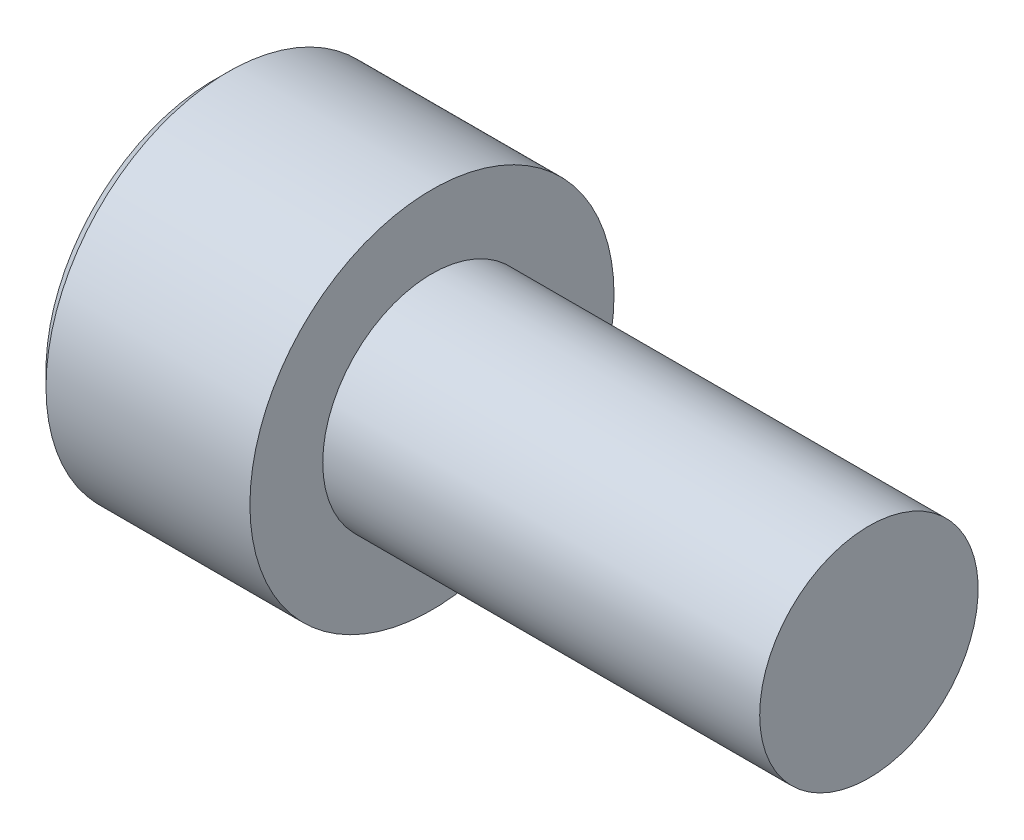
ISO-10303-21;
HEADER;
FILE_DESCRIPTION(('STEP AP214'),'2;1');
FILE_NAME('part.step','',(''),(''),'','','');
FILE_SCHEMA(('AUTOMOTIVE_DESIGN { 1 0 10303 214 1 1 1 1 }'));
ENDSEC;
DATA;
#1=APPLICATION_CONTEXT('core data for automotive mechanical design processes');
#2=APPLICATION_PROTOCOL_DEFINITION('international standard','automotive_design',2000,#1);
#3=PRODUCT_CONTEXT('',#1,'mechanical');
#4=PRODUCT('Part','Part','',(#3));
#5=PRODUCT_RELATED_PRODUCT_CATEGORY('part','',(#4));
#6=PRODUCT_DEFINITION_FORMATION('','',#4);
#7=PRODUCT_DEFINITION_CONTEXT('part definition',#1,'design');
#8=PRODUCT_DEFINITION('design','',#6,#7);
#9=PRODUCT_DEFINITION_SHAPE('','',#8);
#10=(LENGTH_UNIT() NAMED_UNIT(*) SI_UNIT(.MILLI.,.METRE.));
#11=(NAMED_UNIT(*) PLANE_ANGLE_UNIT() SI_UNIT($,.RADIAN.));
#12=(NAMED_UNIT(*) SI_UNIT($,.STERADIAN.) SOLID_ANGLE_UNIT());
#13=UNCERTAINTY_MEASURE_WITH_UNIT(LENGTH_MEASURE(1.E-05),#10,'distance_accuracy_value','');
#14=(GEOMETRIC_REPRESENTATION_CONTEXT(3) GLOBAL_UNCERTAINTY_ASSIGNED_CONTEXT((#13)) GLOBAL_UNIT_ASSIGNED_CONTEXT((#10,
#11,#12)) REPRESENTATION_CONTEXT('',''));
#15=CARTESIAN_POINT('',(0.,0.,0.));
#16=DIRECTION('',(0.,0.,1.));
#17=DIRECTION('',(1.,0.,0.));
#18=AXIS2_PLACEMENT_3D('',#15,#16,#17);
#19=CARTESIAN_POINT('',(-6.,5.,0.));
#20=DIRECTION('',(1.,0.,0.));
#21=DIRECTION('',(0.,0.,-1.));
#22=AXIS2_PLACEMENT_3D('',#19,#20,#21);
#23=PLANE('',#22);
#24=CARTESIAN_POINT('',(-6.,0.,0.));
#25=DIRECTION('',(1.,0.,0.));
#26=DIRECTION('',(0.,0.,-1.));
#27=AXIS2_PLACEMENT_3D('',#24,#25,#26);
#28=CIRCLE('',#27,4.6);
#29=CARTESIAN_POINT('',(-6.,0.,-4.6));
#30=VERTEX_POINT('',#29);
#31=EDGE_CURVE('E44',#30,#30,#28,.F.);
#32=ORIENTED_EDGE('',*,*,#31,.T.);
#33=EDGE_LOOP('',(#32));
#34=FACE_BOUND('',#33,.T.);
#35=DIRECTION('',(0.,0.866025403784438,-0.5));
#36=VECTOR('',#35,1.);
#37=CARTESIAN_POINT('',(-6.,0.,2.88675134594813));
#38=LINE('',#37,#36);
#39=CARTESIAN_POINT('',(-6.,0.,2.88675134594813));
#40=VERTEX_POINT('',#39);
#41=CARTESIAN_POINT('',(-6.,2.5,1.44337567297406));
#42=VERTEX_POINT('',#41);
#43=EDGE_CURVE('E148',#40,#42,#38,.T.);
#44=ORIENTED_EDGE('',*,*,#43,.F.);
#45=DIRECTION('',(0.,0.866025403784439,0.5));
#46=VECTOR('',#45,1.);
#47=CARTESIAN_POINT('',(-6.,-2.5,1.44337567297407));
#48=LINE('',#47,#46);
#49=CARTESIAN_POINT('',(-6.,-2.5,1.44337567297407));
#50=VERTEX_POINT('',#49);
#51=EDGE_CURVE('E51',#50,#40,#48,.T.);
#52=ORIENTED_EDGE('',*,*,#51,.F.);
#53=DIRECTION('',(0.,0.,1.));
#54=VECTOR('',#53,1.);
#55=CARTESIAN_POINT('',(-6.,-2.5,-1.44337567297406));
#56=LINE('',#55,#54);
#57=CARTESIAN_POINT('',(-6.,-2.5,-1.44337567297406));
#58=VERTEX_POINT('',#57);
#59=EDGE_CURVE('E117',#58,#50,#56,.T.);
#60=ORIENTED_EDGE('',*,*,#59,.F.);
#61=DIRECTION('',(0.,-0.866025403784439,0.5));
#62=VECTOR('',#61,1.);
#63=CARTESIAN_POINT('',(-6.,0.,-2.88675134594813));
#64=LINE('',#63,#62);
#65=CARTESIAN_POINT('',(-6.,0.,-2.88675134594813));
#66=VERTEX_POINT('',#65);
#67=EDGE_CURVE('E154',#66,#58,#64,.T.);
#68=ORIENTED_EDGE('',*,*,#67,.F.);
#69=DIRECTION('',(0.,-0.866025403784439,-0.5));
#70=VECTOR('',#69,1.);
#71=CARTESIAN_POINT('',(-6.,2.5,-1.44337567297406));
#72=LINE('',#71,#70);
#73=CARTESIAN_POINT('',(-6.,2.5,-1.44337567297406));
#74=VERTEX_POINT('',#73);
#75=EDGE_CURVE('E152',#74,#66,#72,.T.);
#76=ORIENTED_EDGE('',*,*,#75,.F.);
#77=DIRECTION('',(0.,0.,-1.));
#78=VECTOR('',#77,1.);
#79=CARTESIAN_POINT('',(-6.,2.5,1.44337567297406));
#80=LINE('',#79,#78);
#81=EDGE_CURVE('E150',#42,#74,#80,.T.);
#82=ORIENTED_EDGE('',*,*,#81,.F.);
#83=EDGE_LOOP('',(#44,#52,#60,#68,#76,#82));
#84=FACE_BOUND('',#83,.T.);
#85=ADVANCED_FACE('F36',(#34,#84),#23,.F.);
#86=CARTESIAN_POINT('',(12.,0.,0.));
#87=DIRECTION('',(-1.,0.,0.));
#88=DIRECTION('',(0.,0.,1.));
#89=AXIS2_PLACEMENT_3D('',#86,#87,#88);
#90=PLANE('',#89);
#91=CARTESIAN_POINT('',(12.,0.,0.));
#92=DIRECTION('',(-1.,0.,0.));
#93=DIRECTION('',(0.,0.,1.));
#94=AXIS2_PLACEMENT_3D('',#91,#92,#93);
#95=CIRCLE('',#94,3.);
#96=CARTESIAN_POINT('',(12.,0.,3.));
#97=VERTEX_POINT('',#96);
#98=EDGE_CURVE('E180',#97,#97,#95,.T.);
#99=ORIENTED_EDGE('',*,*,#98,.F.);
#100=EDGE_LOOP('',(#99));
#101=FACE_BOUND('',#100,.T.);
#102=ADVANCED_FACE('F197',(#101),#90,.F.);
#103=CARTESIAN_POINT('',(-6.,0.,0.));
#104=DIRECTION('',(-1.,0.,0.));
#105=DIRECTION('',(0.,0.,1.));
#106=AXIS2_PLACEMENT_3D('',#103,#104,#105);
#107=CYLINDRICAL_SURFACE('',#106,3.);
#108=CARTESIAN_POINT('',(0.,0.,0.));
#109=DIRECTION('',(-1.,0.,0.));
#110=DIRECTION('',(0.,0.,1.));
#111=AXIS2_PLACEMENT_3D('',#108,#109,#110);
#112=CIRCLE('',#111,3.);
#113=CARTESIAN_POINT('',(0.,0.,3.));
#114=VERTEX_POINT('',#113);
#115=EDGE_CURVE('E177',#114,#114,#112,.T.);
#116=ORIENTED_EDGE('',*,*,#115,.F.);
#117=EDGE_LOOP('',(#116));
#118=FACE_BOUND('',#117,.T.);
#119=ORIENTED_EDGE('',*,*,#98,.T.);
#120=EDGE_LOOP('',(#119));
#121=FACE_BOUND('',#120,.T.);
#122=ADVANCED_FACE('F201',(#118,#121),#107,.T.);
#123=CARTESIAN_POINT('',(0.,3.,0.));
#124=DIRECTION('',(-1.,0.,0.));
#125=DIRECTION('',(0.,0.,1.));
#126=AXIS2_PLACEMENT_3D('',#123,#124,#125);
#127=PLANE('',#126);
#128=CARTESIAN_POINT('',(0.,0.,0.));
#129=DIRECTION('',(-1.,0.,0.));
#130=DIRECTION('',(0.,0.,1.));
#131=AXIS2_PLACEMENT_3D('',#128,#129,#130);
#132=CIRCLE('',#131,5.);
#133=CARTESIAN_POINT('',(0.,0.,5.));
#134=VERTEX_POINT('',#133);
#135=EDGE_CURVE('E173',#134,#134,#132,.T.);
#136=ORIENTED_EDGE('',*,*,#135,.F.);
#137=EDGE_LOOP('',(#136));
#138=FACE_BOUND('',#137,.T.);
#139=ORIENTED_EDGE('',*,*,#115,.T.);
#140=EDGE_LOOP('',(#139));
#141=FACE_BOUND('',#140,.T.);
#142=ADVANCED_FACE('F207',(#138,#141),#127,.F.);
#143=CARTESIAN_POINT('',(-6.,0.,0.));
#144=DIRECTION('',(-1.,0.,0.));
#145=DIRECTION('',(0.,0.,1.));
#146=AXIS2_PLACEMENT_3D('',#143,#144,#145);
#147=CYLINDRICAL_SURFACE('',#146,5.);
#148=CARTESIAN_POINT('',(-5.6,0.,0.));
#149=DIRECTION('',(1.,0.,0.));
#150=DIRECTION('',(0.,0.,-1.));
#151=AXIS2_PLACEMENT_3D('',#148,#149,#150);
#152=CIRCLE('',#151,5.);
#153=CARTESIAN_POINT('',(-5.6,0.,-5.));
#154=VERTEX_POINT('',#153);
#155=EDGE_CURVE('E11',#154,#154,#152,.T.);
#156=ORIENTED_EDGE('',*,*,#155,.T.);
#157=EDGE_LOOP('',(#156));
#158=FACE_BOUND('',#157,.T.);
#159=ORIENTED_EDGE('',*,*,#135,.T.);
#160=EDGE_LOOP('',(#159));
#161=FACE_BOUND('',#160,.T.);
#162=ADVANCED_FACE('F211',(#158,#161),#147,.T.);
#163=CARTESIAN_POINT('',(-3.,-2.5,1.44337567297407));
#164=DIRECTION('',(0.,-0.5,0.866025403784439));
#165=DIRECTION('',(0.,-0.866025403784439,-0.5));
#166=AXIS2_PLACEMENT_3D('',#163,#164,#165);
#167=PLANE('',#166);
#168=DIRECTION('',(0.,0.866025403784439,0.5));
#169=VECTOR('',#168,1.);
#170=CARTESIAN_POINT('',(-3.,-2.5,1.44337567297407));
#171=LINE('',#170,#169);
#172=CARTESIAN_POINT('',(-3.,-2.5,1.44337567297407));
#173=VERTEX_POINT('',#172);
#174=CARTESIAN_POINT('',(-3.,-1.25,2.1650635094611));
#175=VERTEX_POINT('',#174);
#176=EDGE_CURVE('E116',#173,#175,#171,.T.);
#177=ORIENTED_EDGE('',*,*,#176,.F.);
#178=DIRECTION('',(-1.,0.,0.));
#179=VECTOR('',#178,1.);
#180=CARTESIAN_POINT('',(-3.,-2.5,1.44337567297407));
#181=LINE('',#180,#179);
#182=EDGE_CURVE('E157',#173,#50,#181,.T.);
#183=ORIENTED_EDGE('',*,*,#182,.T.);
#184=ORIENTED_EDGE('',*,*,#51,.T.);
#185=DIRECTION('',(-1.,0.,0.));
#186=VECTOR('',#185,1.);
#187=CARTESIAN_POINT('',(-3.,0.,2.88675134594813));
#188=LINE('',#187,#186);
#189=CARTESIAN_POINT('',(-3.,0.,2.88675134594813));
#190=VERTEX_POINT('',#189);
#191=EDGE_CURVE('E120',#190,#40,#188,.T.);
#192=ORIENTED_EDGE('',*,*,#191,.F.);
#193=EDGE_CURVE('E110',#175,#190,#171,.T.);
#194=ORIENTED_EDGE('',*,*,#193,.F.);
#195=EDGE_LOOP('',(#177,#183,#184,#192,#194));
#196=FACE_BOUND('',#195,.T.);
#197=ADVANCED_FACE('F121',(#196),#167,.F.);
#198=CARTESIAN_POINT('',(-3.,-2.5,-1.44337567297406));
#199=DIRECTION('',(0.,-1.,0.));
#200=DIRECTION('',(0.,0.,-1.));
#201=AXIS2_PLACEMENT_3D('',#198,#199,#200);
#202=PLANE('',#201);
#203=DIRECTION('',(0.,0.,1.));
#204=VECTOR('',#203,1.);
#205=CARTESIAN_POINT('',(-3.,-2.5,-1.44337567297406));
#206=LINE('',#205,#204);
#207=CARTESIAN_POINT('',(-3.,-2.5,-1.44337567297406));
#208=VERTEX_POINT('',#207);
#209=CARTESIAN_POINT('',(-3.,-2.5,0.));
#210=VERTEX_POINT('',#209);
#211=EDGE_CURVE('E124',#208,#210,#206,.T.);
#212=ORIENTED_EDGE('',*,*,#211,.F.);
#213=DIRECTION('',(-1.,0.,0.));
#214=VECTOR('',#213,1.);
#215=CARTESIAN_POINT('',(-3.,-2.5,-1.44337567297406));
#216=LINE('',#215,#214);
#217=EDGE_CURVE('E159',#208,#58,#216,.T.);
#218=ORIENTED_EDGE('',*,*,#217,.T.);
#219=ORIENTED_EDGE('',*,*,#59,.T.);
#220=ORIENTED_EDGE('',*,*,#182,.F.);
#221=EDGE_CURVE('E144',#210,#173,#206,.T.);
#222=ORIENTED_EDGE('',*,*,#221,.F.);
#223=EDGE_LOOP('',(#212,#218,#219,#220,#222));
#224=FACE_BOUND('',#223,.T.);
#225=ADVANCED_FACE('F218',(#224),#202,.F.);
#226=CARTESIAN_POINT('',(-3.,0.,-2.88675134594813));
#227=DIRECTION('',(0.,-0.5,-0.866025403784438));
#228=DIRECTION('',(0.,0.866025403784439,-0.5));
#229=AXIS2_PLACEMENT_3D('',#226,#227,#228);
#230=PLANE('',#229);
#231=DIRECTION('',(0.,-0.866025403784439,0.5));
#232=VECTOR('',#231,1.);
#233=CARTESIAN_POINT('',(-3.,0.,-2.88675134594813));
#234=LINE('',#233,#232);
#235=CARTESIAN_POINT('',(-3.,0.,-2.88675134594813));
#236=VERTEX_POINT('',#235);
#237=CARTESIAN_POINT('',(-3.,-1.25,-2.1650635094611));
#238=VERTEX_POINT('',#237);
#239=EDGE_CURVE('E141',#236,#238,#234,.T.);
#240=ORIENTED_EDGE('',*,*,#239,.F.);
#241=DIRECTION('',(-1.,0.,0.));
#242=VECTOR('',#241,1.);
#243=CARTESIAN_POINT('',(-3.,0.,-2.88675134594813));
#244=LINE('',#243,#242);
#245=EDGE_CURVE('E162',#236,#66,#244,.T.);
#246=ORIENTED_EDGE('',*,*,#245,.T.);
#247=ORIENTED_EDGE('',*,*,#67,.T.);
#248=ORIENTED_EDGE('',*,*,#217,.F.);
#249=EDGE_CURVE('E140',#238,#208,#234,.T.);
#250=ORIENTED_EDGE('',*,*,#249,.F.);
#251=EDGE_LOOP('',(#240,#246,#247,#248,#250));
#252=FACE_BOUND('',#251,.T.);
#253=ADVANCED_FACE('F229',(#252),#230,.F.);
#254=CARTESIAN_POINT('',(-3.,2.5,-1.44337567297406));
#255=DIRECTION('',(0.,0.5,-0.866025403784438));
#256=DIRECTION('',(0.,0.866025403784439,0.5));
#257=AXIS2_PLACEMENT_3D('',#254,#255,#256);
#258=PLANE('',#257);
#259=DIRECTION('',(0.,-0.866025403784439,-0.5));
#260=VECTOR('',#259,1.);
#261=CARTESIAN_POINT('',(-3.,2.5,-1.44337567297406));
#262=LINE('',#261,#260);
#263=CARTESIAN_POINT('',(-3.,2.5,-1.44337567297406));
#264=VERTEX_POINT('',#263);
#265=CARTESIAN_POINT('',(-3.,1.25,-2.1650635094611));
#266=VERTEX_POINT('',#265);
#267=EDGE_CURVE('E137',#264,#266,#262,.T.);
#268=ORIENTED_EDGE('',*,*,#267,.F.);
#269=DIRECTION('',(-1.,0.,0.));
#270=VECTOR('',#269,1.);
#271=CARTESIAN_POINT('',(-3.,2.5,-1.44337567297406));
#272=LINE('',#271,#270);
#273=EDGE_CURVE('E165',#264,#74,#272,.T.);
#274=ORIENTED_EDGE('',*,*,#273,.T.);
#275=ORIENTED_EDGE('',*,*,#75,.T.);
#276=ORIENTED_EDGE('',*,*,#245,.F.);
#277=EDGE_CURVE('E136',#266,#236,#262,.T.);
#278=ORIENTED_EDGE('',*,*,#277,.F.);
#279=EDGE_LOOP('',(#268,#274,#275,#276,#278));
#280=FACE_BOUND('',#279,.T.);
#281=ADVANCED_FACE('F225',(#280),#258,.F.);
#282=CARTESIAN_POINT('',(-3.,2.5,1.44337567297406));
#283=DIRECTION('',(0.,1.,0.));
#284=DIRECTION('',(0.,0.,1.));
#285=AXIS2_PLACEMENT_3D('',#282,#283,#284);
#286=PLANE('',#285);
#287=DIRECTION('',(0.,0.,-1.));
#288=VECTOR('',#287,1.);
#289=CARTESIAN_POINT('',(-3.,2.5,1.44337567297406));
#290=LINE('',#289,#288);
#291=CARTESIAN_POINT('',(-3.,2.5,1.44337567297406));
#292=VERTEX_POINT('',#291);
#293=CARTESIAN_POINT('',(-3.,2.5,0.));
#294=VERTEX_POINT('',#293);
#295=EDGE_CURVE('E132',#292,#294,#290,.T.);
#296=ORIENTED_EDGE('',*,*,#295,.F.);
#297=DIRECTION('',(-1.,0.,0.));
#298=VECTOR('',#297,1.);
#299=CARTESIAN_POINT('',(-3.,2.5,1.44337567297406));
#300=LINE('',#299,#298);
#301=EDGE_CURVE('E123',#292,#42,#300,.T.);
#302=ORIENTED_EDGE('',*,*,#301,.T.);
#303=ORIENTED_EDGE('',*,*,#81,.T.);
#304=ORIENTED_EDGE('',*,*,#273,.F.);
#305=EDGE_CURVE('E130',#294,#264,#290,.T.);
#306=ORIENTED_EDGE('',*,*,#305,.F.);
#307=EDGE_LOOP('',(#296,#302,#303,#304,#306));
#308=FACE_BOUND('',#307,.T.);
#309=ADVANCED_FACE('F222',(#308),#286,.F.);
#310=CARTESIAN_POINT('',(-3.,0.,2.88675134594813));
#311=DIRECTION('',(0.,0.5,0.866025403784439));
#312=DIRECTION('',(0.,-0.866025403784439,0.5));
#313=AXIS2_PLACEMENT_3D('',#310,#311,#312);
#314=PLANE('',#313);
#315=DIRECTION('',(0.,0.866025403784438,-0.5));
#316=VECTOR('',#315,1.);
#317=CARTESIAN_POINT('',(-3.,0.,2.88675134594813));
#318=LINE('',#317,#316);
#319=CARTESIAN_POINT('',(-3.,1.25,2.1650635094611));
#320=VERTEX_POINT('',#319);
#321=EDGE_CURVE('E59',#190,#320,#318,.T.);
#322=ORIENTED_EDGE('',*,*,#321,.F.);
#323=ORIENTED_EDGE('',*,*,#191,.T.);
#324=ORIENTED_EDGE('',*,*,#43,.T.);
#325=ORIENTED_EDGE('',*,*,#301,.F.);
#326=EDGE_CURVE('E128',#320,#292,#318,.T.);
#327=ORIENTED_EDGE('',*,*,#326,.F.);
#328=EDGE_LOOP('',(#322,#323,#324,#325,#327));
#329=FACE_BOUND('',#328,.T.);
#330=ADVANCED_FACE('F126',(#329),#314,.F.);
#331=CARTESIAN_POINT('',(-3.,0.,0.));
#332=DIRECTION('',(-1.,0.,0.));
#333=DIRECTION('',(0.,0.,1.));
#334=AXIS2_PLACEMENT_3D('',#331,#332,#333);
#335=PLANE('',#334);
#336=ORIENTED_EDGE('',*,*,#326,.T.);
#337=ORIENTED_EDGE('',*,*,#295,.T.);
#338=CARTESIAN_POINT('',(-3.,0.,0.));
#339=DIRECTION('',(-1.,0.,0.));
#340=DIRECTION('',(0.,0.,1.));
#341=AXIS2_PLACEMENT_3D('',#338,#339,#340);
#342=CIRCLE('',#341,2.5);
#343=EDGE_CURVE('E170',#320,#294,#342,.T.);
#344=ORIENTED_EDGE('',*,*,#343,.F.);
#345=EDGE_LOOP('',(#336,#337,#344));
#346=FACE_BOUND('',#345,.T.);
#347=ADVANCED_FACE('F221',(#346),#335,.T.);
#348=ORIENTED_EDGE('',*,*,#305,.T.);
#349=ORIENTED_EDGE('',*,*,#267,.T.);
#350=EDGE_CURVE('E174',#294,#266,#342,.T.);
#351=ORIENTED_EDGE('',*,*,#350,.F.);
#352=EDGE_LOOP('',(#348,#349,#351));
#353=FACE_BOUND('',#352,.T.);
#354=ADVANCED_FACE('F245',(#353),#335,.T.);
#355=ORIENTED_EDGE('',*,*,#277,.T.);
#356=ORIENTED_EDGE('',*,*,#239,.T.);
#357=EDGE_CURVE('E259',#266,#238,#342,.T.);
#358=ORIENTED_EDGE('',*,*,#357,.F.);
#359=EDGE_LOOP('',(#355,#356,#358));
#360=FACE_BOUND('',#359,.T.);
#361=ADVANCED_FACE('F250',(#360),#335,.T.);
#362=ORIENTED_EDGE('',*,*,#249,.T.);
#363=ORIENTED_EDGE('',*,*,#211,.T.);
#364=EDGE_CURVE('E260',#238,#210,#342,.T.);
#365=ORIENTED_EDGE('',*,*,#364,.F.);
#366=EDGE_LOOP('',(#362,#363,#365));
#367=FACE_BOUND('',#366,.T.);
#368=ADVANCED_FACE('F242',(#367),#335,.T.);
#369=ORIENTED_EDGE('',*,*,#221,.T.);
#370=ORIENTED_EDGE('',*,*,#176,.T.);
#371=EDGE_CURVE('E262',#210,#175,#342,.T.);
#372=ORIENTED_EDGE('',*,*,#371,.F.);
#373=EDGE_LOOP('',(#369,#370,#372));
#374=FACE_BOUND('',#373,.T.);
#375=ADVANCED_FACE('F238',(#374),#335,.T.);
#376=ORIENTED_EDGE('',*,*,#193,.T.);
#377=ORIENTED_EDGE('',*,*,#321,.T.);
#378=EDGE_CURVE('E113',#175,#320,#342,.T.);
#379=ORIENTED_EDGE('',*,*,#378,.F.);
#380=EDGE_LOOP('',(#376,#377,#379));
#381=FACE_BOUND('',#380,.T.);
#382=ADVANCED_FACE('F111',(#381),#335,.T.);
#383=CARTESIAN_POINT('',(-1.55662432702592,0.,0.));
#384=DIRECTION('',(-1.,0.,0.));
#385=DIRECTION('',(0.,0.,1.));
#386=AXIS2_PLACEMENT_3D('',#383,#384,#385);
#387=CONICAL_SURFACE('',#386,0.,1.04719755119659);
#388=ORIENTED_EDGE('',*,*,#343,.T.);
#389=ORIENTED_EDGE('',*,*,#350,.T.);
#390=ORIENTED_EDGE('',*,*,#357,.T.);
#391=ORIENTED_EDGE('',*,*,#364,.T.);
#392=ORIENTED_EDGE('',*,*,#371,.T.);
#393=ORIENTED_EDGE('',*,*,#378,.T.);
#394=EDGE_LOOP('',(#388,#389,#390,#391,#392,#393));
#395=FACE_BOUND('',#394,.T.);
#396=CARTESIAN_POINT('',(-1.55662432702592,0.,0.));
#397=VERTEX_POINT('',#396);
#398=VERTEX_LOOP('',#397);
#399=FACE_BOUND('',#398,.T.);
#400=ADVANCED_FACE('F188',(#395,#399),#387,.F.);
#401=CARTESIAN_POINT('',(-6.,0.,0.));
#402=DIRECTION('',(1.,0.,0.));
#403=DIRECTION('',(0.,0.,-1.));
#404=AXIS2_PLACEMENT_3D('',#401,#402,#403);
#405=CONICAL_SURFACE('',#404,4.6,0.785398163397448);
#406=ORIENTED_EDGE('',*,*,#155,.F.);
#407=EDGE_LOOP('',(#406));
#408=FACE_BOUND('',#407,.T.);
#409=ORIENTED_EDGE('',*,*,#31,.F.);
#410=EDGE_LOOP('',(#409));
#411=FACE_BOUND('',#410,.T.);
#412=ADVANCED_FACE('F38',(#408,#411),#405,.T.);
#413=CLOSED_SHELL('',(#85,#102,#122,#142,#162,#197,#225,#253,#281,#309,#330,#347,#354,#361,#368,
#375,#382,#400,#412));
#414=MANIFOLD_SOLID_BREP('B2',#413);
#415=ADVANCED_BREP_SHAPE_REPRESENTATION('',(#18,#414),#14);
#416=SHAPE_DEFINITION_REPRESENTATION(#9,#415);
ENDSEC;
END-ISO-10303-21;
